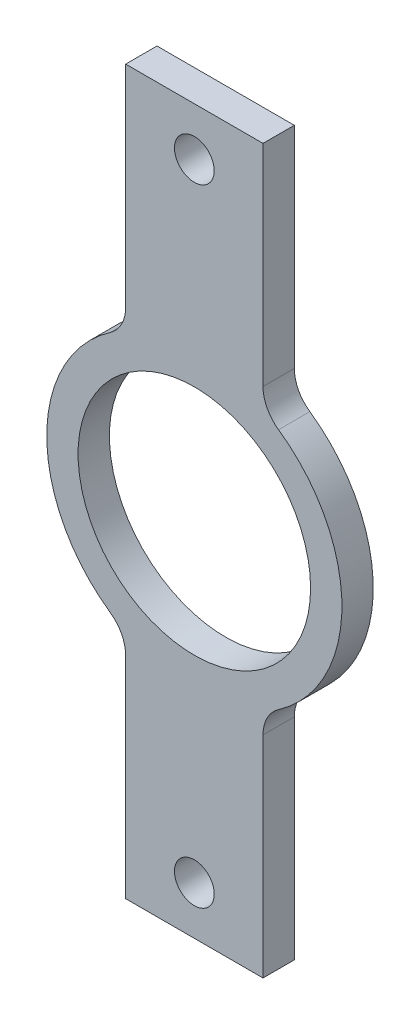
ISO-10303-21;
HEADER;
FILE_DESCRIPTION(('STEP AP214'),'2;1');
FILE_NAME('part.step','',(''),(''),'','','');
FILE_SCHEMA(('AUTOMOTIVE_DESIGN { 1 0 10303 214 1 1 1 1 }'));
ENDSEC;
DATA;
#1=APPLICATION_CONTEXT('core data for automotive mechanical design processes');
#2=APPLICATION_PROTOCOL_DEFINITION('international standard','automotive_design',2000,#1);
#3=PRODUCT_CONTEXT('',#1,'mechanical');
#4=PRODUCT('Part','Part','',(#3));
#5=PRODUCT_RELATED_PRODUCT_CATEGORY('part','',(#4));
#6=PRODUCT_DEFINITION_FORMATION('','',#4);
#7=PRODUCT_DEFINITION_CONTEXT('part definition',#1,'design');
#8=PRODUCT_DEFINITION('design','',#6,#7);
#9=PRODUCT_DEFINITION_SHAPE('','',#8);
#10=(LENGTH_UNIT() NAMED_UNIT(*) SI_UNIT(.MILLI.,.METRE.));
#11=(NAMED_UNIT(*) PLANE_ANGLE_UNIT() SI_UNIT($,.RADIAN.));
#12=(NAMED_UNIT(*) SI_UNIT($,.STERADIAN.) SOLID_ANGLE_UNIT());
#13=UNCERTAINTY_MEASURE_WITH_UNIT(LENGTH_MEASURE(1.E-05),#10,'distance_accuracy_value','');
#14=(GEOMETRIC_REPRESENTATION_CONTEXT(3) GLOBAL_UNCERTAINTY_ASSIGNED_CONTEXT((#13)) GLOBAL_UNIT_ASSIGNED_CONTEXT((#10,
#11,#12)) REPRESENTATION_CONTEXT('',''));
#15=CARTESIAN_POINT('',(0.,0.,0.));
#16=DIRECTION('',(0.,0.,1.));
#17=DIRECTION('',(1.,0.,0.));
#18=AXIS2_PLACEMENT_3D('',#15,#16,#17);
#19=CARTESIAN_POINT('',(0.,0.,2.6));
#20=DIRECTION('',(0.,0.,1.));
#21=DIRECTION('',(1.,0.,0.));
#22=AXIS2_PLACEMENT_3D('',#19,#20,#21);
#23=PLANE('',#22);
#24=CARTESIAN_POINT('',(0.,26.,2.6));
#25=DIRECTION('',(0.,0.,1.));
#26=DIRECTION('',(1.,0.,0.));
#27=AXIS2_PLACEMENT_3D('',#24,#25,#26);
#28=CIRCLE('',#27,1.65);
#29=CARTESIAN_POINT('',(1.65,26.,2.6));
#30=VERTEX_POINT('',#29);
#31=EDGE_CURVE('E299',#30,#30,#28,.T.);
#32=ORIENTED_EDGE('',*,*,#31,.F.);
#33=EDGE_LOOP('',(#32));
#34=FACE_BOUND('',#33,.T.);
#35=DIRECTION('',(0.,1.,0.));
#36=VECTOR('',#35,1.);
#37=CARTESIAN_POINT('',(5.7,-30.,2.6));
#38=LINE('',#37,#36);
#39=CARTESIAN_POINT('',(5.7,-30.,2.6));
#40=VERTEX_POINT('',#39);
#41=CARTESIAN_POINT('',(5.7,-12.5248752488797,2.6));
#42=VERTEX_POINT('',#41);
#43=EDGE_CURVE('E156',#40,#42,#38,.T.);
#44=ORIENTED_EDGE('',*,*,#43,.T.);
#45=CARTESIAN_POINT('',(8.7,-12.5248752488797,2.6));
#46=DIRECTION('',(0.,0.,1.));
#47=DIRECTION('',(1.,0.,0.));
#48=AXIS2_PLACEMENT_3D('',#45,#46,#47);
#49=CIRCLE('',#48,3.);
#50=CARTESIAN_POINT('',(6.98852459016393,-10.0609653638542,2.6));
#51=VERTEX_POINT('',#50);
#52=EDGE_CURVE('E205',#42,#51,#49,.F.);
#53=ORIENTED_EDGE('',*,*,#52,.T.);
#54=CARTESIAN_POINT('',(0.,0.,2.6));
#55=DIRECTION('',(0.,0.,1.));
#56=DIRECTION('',(1.,0.,0.));
#57=AXIS2_PLACEMENT_3D('',#54,#55,#56);
#58=CIRCLE('',#57,12.25);
#59=CARTESIAN_POINT('',(6.98852459016393,10.0609653638542,2.6));
#60=VERTEX_POINT('',#59);
#61=EDGE_CURVE('E129',#51,#60,#58,.T.);
#62=ORIENTED_EDGE('',*,*,#61,.T.);
#63=CARTESIAN_POINT('',(8.7,12.5248752488797,2.6));
#64=DIRECTION('',(0.,0.,1.));
#65=DIRECTION('',(1.,0.,0.));
#66=AXIS2_PLACEMENT_3D('',#63,#64,#65);
#67=CIRCLE('',#66,3.);
#68=CARTESIAN_POINT('',(5.7,12.5248752488797,2.6));
#69=VERTEX_POINT('',#68);
#70=EDGE_CURVE('E11',#60,#69,#67,.F.);
#71=ORIENTED_EDGE('',*,*,#70,.T.);
#72=DIRECTION('',(0.,1.,0.));
#73=VECTOR('',#72,1.);
#74=CARTESIAN_POINT('',(5.7,10.8430853542707,2.6));
#75=LINE('',#74,#73);
#76=CARTESIAN_POINT('',(5.7,30.,2.6));
#77=VERTEX_POINT('',#76);
#78=EDGE_CURVE('E120',#69,#77,#75,.T.);
#79=ORIENTED_EDGE('',*,*,#78,.T.);
#80=DIRECTION('',(-1.,0.,0.));
#81=VECTOR('',#80,1.);
#82=CARTESIAN_POINT('',(5.7,30.,2.6));
#83=LINE('',#82,#81);
#84=CARTESIAN_POINT('',(-5.7,30.,2.6));
#85=VERTEX_POINT('',#84);
#86=EDGE_CURVE('E126',#77,#85,#83,.T.);
#87=ORIENTED_EDGE('',*,*,#86,.T.);
#88=DIRECTION('',(0.,-1.,0.));
#89=VECTOR('',#88,1.);
#90=CARTESIAN_POINT('',(-5.7,30.,2.6));
#91=LINE('',#90,#89);
#92=CARTESIAN_POINT('',(-5.7,12.5248752488797,2.6));
#93=VERTEX_POINT('',#92);
#94=EDGE_CURVE('E144',#85,#93,#91,.T.);
#95=ORIENTED_EDGE('',*,*,#94,.T.);
#96=CARTESIAN_POINT('',(-8.7,12.5248752488797,2.6));
#97=DIRECTION('',(0.,0.,1.));
#98=DIRECTION('',(1.,0.,0.));
#99=AXIS2_PLACEMENT_3D('',#96,#97,#98);
#100=CIRCLE('',#99,3.);
#101=CARTESIAN_POINT('',(-6.98852459016393,10.0609653638542,2.6));
#102=VERTEX_POINT('',#101);
#103=EDGE_CURVE('E213',#93,#102,#100,.F.);
#104=ORIENTED_EDGE('',*,*,#103,.T.);
#105=CARTESIAN_POINT('',(0.,0.,2.6));
#106=DIRECTION('',(0.,0.,1.));
#107=DIRECTION('',(1.,0.,0.));
#108=AXIS2_PLACEMENT_3D('',#105,#106,#107);
#109=CIRCLE('',#108,12.25);
#110=CARTESIAN_POINT('',(-6.98852459016393,-10.0609653638542,2.6));
#111=VERTEX_POINT('',#110);
#112=EDGE_CURVE('E146',#102,#111,#109,.T.);
#113=ORIENTED_EDGE('',*,*,#112,.T.);
#114=CARTESIAN_POINT('',(-8.7,-12.5248752488797,2.6));
#115=DIRECTION('',(0.,0.,1.));
#116=DIRECTION('',(1.,0.,0.));
#117=AXIS2_PLACEMENT_3D('',#114,#115,#116);
#118=CIRCLE('',#117,3.);
#119=CARTESIAN_POINT('',(-5.7,-12.5248752488797,2.6));
#120=VERTEX_POINT('',#119);
#121=EDGE_CURVE('E209',#111,#120,#118,.F.);
#122=ORIENTED_EDGE('',*,*,#121,.T.);
#123=DIRECTION('',(0.,-1.,0.));
#124=VECTOR('',#123,1.);
#125=CARTESIAN_POINT('',(-5.7,-10.8430853542707,2.6));
#126=LINE('',#125,#124);
#127=CARTESIAN_POINT('',(-5.69999999999999,-30.,2.6));
#128=VERTEX_POINT('',#127);
#129=EDGE_CURVE('E152',#120,#128,#126,.T.);
#130=ORIENTED_EDGE('',*,*,#129,.T.);
#131=DIRECTION('',(1.,0.,0.));
#132=VECTOR('',#131,1.);
#133=CARTESIAN_POINT('',(-5.69999999999999,-30.,2.6));
#134=LINE('',#133,#132);
#135=EDGE_CURVE('E154',#128,#40,#134,.T.);
#136=ORIENTED_EDGE('',*,*,#135,.T.);
#137=EDGE_LOOP('',(#44,#53,#62,#71,#79,#87,#95,#104,#113,#122,#130,#136));
#138=FACE_BOUND('',#137,.T.);
#139=CARTESIAN_POINT('',(0.,0.,2.6));
#140=DIRECTION('',(0.,0.,1.));
#141=DIRECTION('',(1.,0.,0.));
#142=AXIS2_PLACEMENT_3D('',#139,#140,#141);
#143=CIRCLE('',#142,9.65);
#144=CARTESIAN_POINT('',(9.65,0.,2.6));
#145=VERTEX_POINT('',#144);
#146=EDGE_CURVE('E162',#145,#145,#143,.T.);
#147=ORIENTED_EDGE('',*,*,#146,.F.);
#148=EDGE_LOOP('',(#147));
#149=FACE_BOUND('',#148,.T.);
#150=CARTESIAN_POINT('',(0.,-26.,2.6));
#151=DIRECTION('',(0.,0.,1.));
#152=DIRECTION('',(1.,0.,0.));
#153=AXIS2_PLACEMENT_3D('',#150,#151,#152);
#154=CIRCLE('',#153,1.65);
#155=CARTESIAN_POINT('',(1.65,-26.,2.6));
#156=VERTEX_POINT('',#155);
#157=EDGE_CURVE('E305',#156,#156,#154,.T.);
#158=ORIENTED_EDGE('',*,*,#157,.F.);
#159=EDGE_LOOP('',(#158));
#160=FACE_BOUND('',#159,.T.);
#161=ADVANCED_FACE('F35',(#34,#138,#149,#160),#23,.T.);
#162=CARTESIAN_POINT('',(0.,0.,0.));
#163=DIRECTION('',(0.,0.,1.));
#164=DIRECTION('',(1.,0.,0.));
#165=AXIS2_PLACEMENT_3D('',#162,#163,#164);
#166=PLANE('',#165);
#167=CARTESIAN_POINT('',(0.,0.,0.));
#168=DIRECTION('',(0.,0.,1.));
#169=DIRECTION('',(1.,0.,0.));
#170=AXIS2_PLACEMENT_3D('',#167,#168,#169);
#171=CIRCLE('',#170,12.25);
#172=CARTESIAN_POINT('',(6.98852459016393,-10.0609653638542,0.));
#173=VERTEX_POINT('',#172);
#174=CARTESIAN_POINT('',(6.98852459016393,10.0609653638542,0.));
#175=VERTEX_POINT('',#174);
#176=EDGE_CURVE('E159',#173,#175,#171,.T.);
#177=ORIENTED_EDGE('',*,*,#176,.F.);
#178=CARTESIAN_POINT('',(8.7,-12.5248752488797,0.));
#179=DIRECTION('',(0.,0.,1.));
#180=DIRECTION('',(1.,0.,0.));
#181=AXIS2_PLACEMENT_3D('',#178,#179,#180);
#182=CIRCLE('',#181,3.);
#183=CARTESIAN_POINT('',(5.7,-12.5248752488797,0.));
#184=VERTEX_POINT('',#183);
#185=EDGE_CURVE('E203',#173,#184,#182,.T.);
#186=ORIENTED_EDGE('',*,*,#185,.T.);
#187=DIRECTION('',(0.,1.,0.));
#188=VECTOR('',#187,1.);
#189=CARTESIAN_POINT('',(5.7,-30.,0.));
#190=LINE('',#189,#188);
#191=CARTESIAN_POINT('',(5.7,-30.,0.));
#192=VERTEX_POINT('',#191);
#193=EDGE_CURVE('E176',#192,#184,#190,.T.);
#194=ORIENTED_EDGE('',*,*,#193,.F.);
#195=DIRECTION('',(1.,0.,0.));
#196=VECTOR('',#195,1.);
#197=CARTESIAN_POINT('',(0.,-30.,0.));
#198=LINE('',#197,#196);
#199=CARTESIAN_POINT('',(-5.69999999999999,-30.,0.));
#200=VERTEX_POINT('',#199);
#201=EDGE_CURVE('E174',#200,#192,#198,.T.);
#202=ORIENTED_EDGE('',*,*,#201,.F.);
#203=DIRECTION('',(0.,-1.,0.));
#204=VECTOR('',#203,1.);
#205=CARTESIAN_POINT('',(-5.7,-10.8430853542707,0.));
#206=LINE('',#205,#204);
#207=CARTESIAN_POINT('',(-5.7,-12.5248752488797,0.));
#208=VERTEX_POINT('',#207);
#209=EDGE_CURVE('E172',#208,#200,#206,.T.);
#210=ORIENTED_EDGE('',*,*,#209,.F.);
#211=CARTESIAN_POINT('',(-8.7,-12.5248752488797,0.));
#212=DIRECTION('',(0.,0.,1.));
#213=DIRECTION('',(1.,0.,0.));
#214=AXIS2_PLACEMENT_3D('',#211,#212,#213);
#215=CIRCLE('',#214,3.);
#216=CARTESIAN_POINT('',(-6.98852459016393,-10.0609653638542,0.));
#217=VERTEX_POINT('',#216);
#218=EDGE_CURVE('E207',#208,#217,#215,.T.);
#219=ORIENTED_EDGE('',*,*,#218,.T.);
#220=CARTESIAN_POINT('',(0.,0.,0.));
#221=DIRECTION('',(0.,0.,1.));
#222=DIRECTION('',(1.,0.,0.));
#223=AXIS2_PLACEMENT_3D('',#220,#221,#222);
#224=CIRCLE('',#223,12.25);
#225=CARTESIAN_POINT('',(-6.98852459016393,10.0609653638542,0.));
#226=VERTEX_POINT('',#225);
#227=EDGE_CURVE('E169',#226,#217,#224,.T.);
#228=ORIENTED_EDGE('',*,*,#227,.F.);
#229=CARTESIAN_POINT('',(-8.7,12.5248752488797,0.));
#230=DIRECTION('',(0.,0.,1.));
#231=DIRECTION('',(1.,0.,0.));
#232=AXIS2_PLACEMENT_3D('',#229,#230,#231);
#233=CIRCLE('',#232,3.);
#234=CARTESIAN_POINT('',(-5.7,12.5248752488797,0.));
#235=VERTEX_POINT('',#234);
#236=EDGE_CURVE('E211',#226,#235,#233,.T.);
#237=ORIENTED_EDGE('',*,*,#236,.T.);
#238=DIRECTION('',(0.,-1.,0.));
#239=VECTOR('',#238,1.);
#240=CARTESIAN_POINT('',(-5.7,30.,0.));
#241=LINE('',#240,#239);
#242=CARTESIAN_POINT('',(-5.7,30.,0.));
#243=VERTEX_POINT('',#242);
#244=EDGE_CURVE('E166',#243,#235,#241,.T.);
#245=ORIENTED_EDGE('',*,*,#244,.F.);
#246=DIRECTION('',(-1.,0.,0.));
#247=VECTOR('',#246,1.);
#248=CARTESIAN_POINT('',(0.,30.,0.));
#249=LINE('',#248,#247);
#250=CARTESIAN_POINT('',(5.7,30.,0.));
#251=VERTEX_POINT('',#250);
#252=EDGE_CURVE('E164',#251,#243,#249,.T.);
#253=ORIENTED_EDGE('',*,*,#252,.F.);
#254=DIRECTION('',(0.,1.,0.));
#255=VECTOR('',#254,1.);
#256=CARTESIAN_POINT('',(5.7,10.8430853542707,0.));
#257=LINE('',#256,#255);
#258=CARTESIAN_POINT('',(5.7,12.5248752488797,0.));
#259=VERTEX_POINT('',#258);
#260=EDGE_CURVE('E135',#259,#251,#257,.T.);
#261=ORIENTED_EDGE('',*,*,#260,.F.);
#262=CARTESIAN_POINT('',(8.7,12.5248752488797,0.));
#263=DIRECTION('',(0.,0.,1.));
#264=DIRECTION('',(1.,0.,0.));
#265=AXIS2_PLACEMENT_3D('',#262,#263,#264);
#266=CIRCLE('',#265,3.);
#267=EDGE_CURVE('E43',#259,#175,#266,.T.);
#268=ORIENTED_EDGE('',*,*,#267,.T.);
#269=EDGE_LOOP('',(#177,#186,#194,#202,#210,#219,#228,#237,#245,#253,#261,#268));
#270=FACE_BOUND('',#269,.T.);
#271=CARTESIAN_POINT('',(0.,0.,0.));
#272=DIRECTION('',(0.,0.,1.));
#273=DIRECTION('',(1.,0.,0.));
#274=AXIS2_PLACEMENT_3D('',#271,#272,#273);
#275=CIRCLE('',#274,9.65);
#276=CARTESIAN_POINT('',(9.65,0.,0.));
#277=VERTEX_POINT('',#276);
#278=EDGE_CURVE('E296',#277,#277,#275,.T.);
#279=ORIENTED_EDGE('',*,*,#278,.T.);
#280=EDGE_LOOP('',(#279));
#281=FACE_BOUND('',#280,.T.);
#282=CARTESIAN_POINT('',(0.,26.,0.));
#283=DIRECTION('',(0.,0.,1.));
#284=DIRECTION('',(1.,0.,0.));
#285=AXIS2_PLACEMENT_3D('',#282,#283,#284);
#286=CIRCLE('',#285,1.65);
#287=CARTESIAN_POINT('',(1.65,26.,0.));
#288=VERTEX_POINT('',#287);
#289=EDGE_CURVE('E302',#288,#288,#286,.T.);
#290=ORIENTED_EDGE('',*,*,#289,.T.);
#291=EDGE_LOOP('',(#290));
#292=FACE_BOUND('',#291,.T.);
#293=CARTESIAN_POINT('',(0.,-26.,0.));
#294=DIRECTION('',(0.,0.,1.));
#295=DIRECTION('',(1.,0.,0.));
#296=AXIS2_PLACEMENT_3D('',#293,#294,#295);
#297=CIRCLE('',#296,1.65);
#298=CARTESIAN_POINT('',(1.65,-26.,0.));
#299=VERTEX_POINT('',#298);
#300=EDGE_CURVE('E308',#299,#299,#297,.T.);
#301=ORIENTED_EDGE('',*,*,#300,.T.);
#302=EDGE_LOOP('',(#301));
#303=FACE_BOUND('',#302,.T.);
#304=ADVANCED_FACE('F216',(#270,#281,#292,#303),#166,.F.);
#305=CARTESIAN_POINT('',(0.,0.,2.6));
#306=DIRECTION('',(0.,0.,-1.));
#307=DIRECTION('',(-1.,0.,0.));
#308=AXIS2_PLACEMENT_3D('',#305,#306,#307);
#309=CYLINDRICAL_SURFACE('',#308,12.25);
#310=ORIENTED_EDGE('',*,*,#61,.F.);
#311=DIRECTION('',(0.,0.,-1.));
#312=VECTOR('',#311,1.);
#313=CARTESIAN_POINT('',(6.98852459016393,-10.0609653638542,2.6));
#314=LINE('',#313,#312);
#315=EDGE_CURVE('E186',#51,#173,#314,.T.);
#316=ORIENTED_EDGE('',*,*,#315,.T.);
#317=ORIENTED_EDGE('',*,*,#176,.T.);
#318=DIRECTION('',(0.,0.,-1.));
#319=VECTOR('',#318,1.);
#320=CARTESIAN_POINT('',(6.98852459016393,10.0609653638542,2.6));
#321=LINE('',#320,#319);
#322=EDGE_CURVE('E138',#175,#60,#321,.F.);
#323=ORIENTED_EDGE('',*,*,#322,.T.);
#324=EDGE_LOOP('',(#310,#316,#317,#323));
#325=FACE_BOUND('',#324,.T.);
#326=ADVANCED_FACE('F220',(#325),#309,.T.);
#327=CARTESIAN_POINT('',(5.7,10.8430853542707,2.6));
#328=DIRECTION('',(-1.,0.,0.));
#329=DIRECTION('',(0.,0.,1.));
#330=AXIS2_PLACEMENT_3D('',#327,#328,#329);
#331=PLANE('',#330);
#332=ORIENTED_EDGE('',*,*,#78,.F.);
#333=DIRECTION('',(0.,0.,1.));
#334=VECTOR('',#333,1.);
#335=CARTESIAN_POINT('',(5.7,12.5248752488797,0.));
#336=LINE('',#335,#334);
#337=EDGE_CURVE('E201',#69,#259,#336,.F.);
#338=ORIENTED_EDGE('',*,*,#337,.T.);
#339=ORIENTED_EDGE('',*,*,#260,.T.);
#340=DIRECTION('',(0.,0.,-1.));
#341=VECTOR('',#340,1.);
#342=CARTESIAN_POINT('',(5.7,30.,2.6));
#343=LINE('',#342,#341);
#344=EDGE_CURVE('E132',#77,#251,#343,.T.);
#345=ORIENTED_EDGE('',*,*,#344,.F.);
#346=EDGE_LOOP('',(#332,#338,#339,#345));
#347=FACE_BOUND('',#346,.T.);
#348=ADVANCED_FACE('F133',(#347),#331,.F.);
#349=CARTESIAN_POINT('',(0.,30.,2.6));
#350=DIRECTION('',(0.,-1.,0.));
#351=DIRECTION('',(0.,0.,-1.));
#352=AXIS2_PLACEMENT_3D('',#349,#350,#351);
#353=PLANE('',#352);
#354=ORIENTED_EDGE('',*,*,#252,.T.);
#355=DIRECTION('',(0.,0.,-1.));
#356=VECTOR('',#355,1.);
#357=CARTESIAN_POINT('',(-5.7,30.,2.6));
#358=LINE('',#357,#356);
#359=EDGE_CURVE('E139',#85,#243,#358,.T.);
#360=ORIENTED_EDGE('',*,*,#359,.F.);
#361=ORIENTED_EDGE('',*,*,#86,.F.);
#362=ORIENTED_EDGE('',*,*,#344,.T.);
#363=EDGE_LOOP('',(#354,#360,#361,#362));
#364=FACE_BOUND('',#363,.T.);
#365=ADVANCED_FACE('F141',(#364),#353,.F.);
#366=CARTESIAN_POINT('',(-5.7,30.,2.6));
#367=DIRECTION('',(1.,0.,0.));
#368=DIRECTION('',(0.,1.,0.));
#369=AXIS2_PLACEMENT_3D('',#366,#367,#368);
#370=PLANE('',#369);
#371=ORIENTED_EDGE('',*,*,#244,.T.);
#372=DIRECTION('',(0.,0.,1.));
#373=VECTOR('',#372,1.);
#374=CARTESIAN_POINT('',(-5.7,12.5248752488797,2.6));
#375=LINE('',#374,#373);
#376=EDGE_CURVE('E199',#235,#93,#375,.T.);
#377=ORIENTED_EDGE('',*,*,#376,.T.);
#378=ORIENTED_EDGE('',*,*,#94,.F.);
#379=ORIENTED_EDGE('',*,*,#359,.T.);
#380=EDGE_LOOP('',(#371,#377,#378,#379));
#381=FACE_BOUND('',#380,.T.);
#382=ADVANCED_FACE('F256',(#381),#370,.F.);
#383=CARTESIAN_POINT('',(0.,0.,2.6));
#384=DIRECTION('',(0.,0.,-1.));
#385=DIRECTION('',(-1.,0.,0.));
#386=AXIS2_PLACEMENT_3D('',#383,#384,#385);
#387=CYLINDRICAL_SURFACE('',#386,12.25);
#388=ORIENTED_EDGE('',*,*,#227,.T.);
#389=DIRECTION('',(0.,0.,-1.));
#390=VECTOR('',#389,1.);
#391=CARTESIAN_POINT('',(-6.98852459016393,-10.0609653638542,2.6));
#392=LINE('',#391,#390);
#393=EDGE_CURVE('E197',#217,#111,#392,.F.);
#394=ORIENTED_EDGE('',*,*,#393,.T.);
#395=ORIENTED_EDGE('',*,*,#112,.F.);
#396=DIRECTION('',(0.,0.,-1.));
#397=VECTOR('',#396,1.);
#398=CARTESIAN_POINT('',(-6.98852459016393,10.0609653638542,2.6));
#399=LINE('',#398,#397);
#400=EDGE_CURVE('E194',#102,#226,#399,.T.);
#401=ORIENTED_EDGE('',*,*,#400,.T.);
#402=EDGE_LOOP('',(#388,#394,#395,#401));
#403=FACE_BOUND('',#402,.T.);
#404=ADVANCED_FACE('F252',(#403),#387,.T.);
#405=CARTESIAN_POINT('',(-5.7,-10.8430853542707,2.6));
#406=DIRECTION('',(1.,0.,0.));
#407=DIRECTION('',(0.,1.,0.));
#408=AXIS2_PLACEMENT_3D('',#405,#406,#407);
#409=PLANE('',#408);
#410=ORIENTED_EDGE('',*,*,#129,.F.);
#411=DIRECTION('',(0.,0.,1.));
#412=VECTOR('',#411,1.);
#413=CARTESIAN_POINT('',(-5.7,-12.5248752488797,0.));
#414=LINE('',#413,#412);
#415=EDGE_CURVE('E191',#120,#208,#414,.F.);
#416=ORIENTED_EDGE('',*,*,#415,.T.);
#417=ORIENTED_EDGE('',*,*,#209,.T.);
#418=DIRECTION('',(0.,0.,-1.));
#419=VECTOR('',#418,1.);
#420=CARTESIAN_POINT('',(-5.69999999999999,-30.,2.6));
#421=LINE('',#420,#419);
#422=EDGE_CURVE('E181',#128,#200,#421,.T.);
#423=ORIENTED_EDGE('',*,*,#422,.F.);
#424=EDGE_LOOP('',(#410,#416,#417,#423));
#425=FACE_BOUND('',#424,.T.);
#426=ADVANCED_FACE('F248',(#425),#409,.F.);
#427=CARTESIAN_POINT('',(0.,-30.,2.6));
#428=DIRECTION('',(0.,1.,0.));
#429=DIRECTION('',(0.,0.,1.));
#430=AXIS2_PLACEMENT_3D('',#427,#428,#429);
#431=PLANE('',#430);
#432=ORIENTED_EDGE('',*,*,#201,.T.);
#433=DIRECTION('',(0.,0.,-1.));
#434=VECTOR('',#433,1.);
#435=CARTESIAN_POINT('',(5.7,-30.,2.6));
#436=LINE('',#435,#434);
#437=EDGE_CURVE('E158',#40,#192,#436,.T.);
#438=ORIENTED_EDGE('',*,*,#437,.F.);
#439=ORIENTED_EDGE('',*,*,#135,.F.);
#440=ORIENTED_EDGE('',*,*,#422,.T.);
#441=EDGE_LOOP('',(#432,#438,#439,#440));
#442=FACE_BOUND('',#441,.T.);
#443=ADVANCED_FACE('F244',(#442),#431,.F.);
#444=CARTESIAN_POINT('',(5.7,-30.,2.6));
#445=DIRECTION('',(-1.,0.,0.));
#446=DIRECTION('',(0.,0.,1.));
#447=AXIS2_PLACEMENT_3D('',#444,#445,#446);
#448=PLANE('',#447);
#449=ORIENTED_EDGE('',*,*,#193,.T.);
#450=DIRECTION('',(0.,0.,1.));
#451=VECTOR('',#450,1.);
#452=CARTESIAN_POINT('',(5.7,-12.5248752488797,2.6));
#453=LINE('',#452,#451);
#454=EDGE_CURVE('E189',#184,#42,#453,.T.);
#455=ORIENTED_EDGE('',*,*,#454,.T.);
#456=ORIENTED_EDGE('',*,*,#43,.F.);
#457=ORIENTED_EDGE('',*,*,#437,.T.);
#458=EDGE_LOOP('',(#449,#455,#456,#457));
#459=FACE_BOUND('',#458,.T.);
#460=ADVANCED_FACE('F241',(#459),#448,.F.);
#461=CARTESIAN_POINT('',(0.,0.,2.6));
#462=DIRECTION('',(0.,0.,-1.));
#463=DIRECTION('',(-1.,0.,0.));
#464=AXIS2_PLACEMENT_3D('',#461,#462,#463);
#465=CYLINDRICAL_SURFACE('',#464,9.65);
#466=ORIENTED_EDGE('',*,*,#146,.T.);
#467=EDGE_LOOP('',(#466));
#468=FACE_BOUND('',#467,.T.);
#469=ORIENTED_EDGE('',*,*,#278,.F.);
#470=EDGE_LOOP('',(#469));
#471=FACE_BOUND('',#470,.T.);
#472=ADVANCED_FACE('F238',(#468,#471),#465,.F.);
#473=CARTESIAN_POINT('',(0.,26.,2.6));
#474=DIRECTION('',(0.,0.,-1.));
#475=DIRECTION('',(-1.,0.,0.));
#476=AXIS2_PLACEMENT_3D('',#473,#474,#475);
#477=CYLINDRICAL_SURFACE('',#476,1.65);
#478=ORIENTED_EDGE('',*,*,#31,.T.);
#479=EDGE_LOOP('',(#478));
#480=FACE_BOUND('',#479,.T.);
#481=ORIENTED_EDGE('',*,*,#289,.F.);
#482=EDGE_LOOP('',(#481));
#483=FACE_BOUND('',#482,.T.);
#484=ADVANCED_FACE('F317',(#480,#483),#477,.F.);
#485=CARTESIAN_POINT('',(0.,-26.,2.6));
#486=DIRECTION('',(0.,0.,-1.));
#487=DIRECTION('',(-1.,0.,0.));
#488=AXIS2_PLACEMENT_3D('',#485,#486,#487);
#489=CYLINDRICAL_SURFACE('',#488,1.65);
#490=ORIENTED_EDGE('',*,*,#157,.T.);
#491=EDGE_LOOP('',(#490));
#492=FACE_BOUND('',#491,.T.);
#493=ORIENTED_EDGE('',*,*,#300,.F.);
#494=EDGE_LOOP('',(#493));
#495=FACE_BOUND('',#494,.T.);
#496=ADVANCED_FACE('F270',(#492,#495),#489,.F.);
#497=CARTESIAN_POINT('',(8.7,-12.5248752488797,2.6));
#498=DIRECTION('',(0.,0.,-1.));
#499=DIRECTION('',(-1.,0.,0.));
#500=AXIS2_PLACEMENT_3D('',#497,#498,#499);
#501=CYLINDRICAL_SURFACE('',#500,3.);
#502=ORIENTED_EDGE('',*,*,#52,.F.);
#503=ORIENTED_EDGE('',*,*,#454,.F.);
#504=ORIENTED_EDGE('',*,*,#185,.F.);
#505=ORIENTED_EDGE('',*,*,#315,.F.);
#506=EDGE_LOOP('',(#502,#503,#504,#505));
#507=FACE_BOUND('',#506,.T.);
#508=ADVANCED_FACE('F267',(#507),#501,.F.);
#509=CARTESIAN_POINT('',(-8.7,-12.5248752488797,2.6));
#510=DIRECTION('',(0.,0.,-1.));
#511=DIRECTION('',(-1.,0.,0.));
#512=AXIS2_PLACEMENT_3D('',#509,#510,#511);
#513=CYLINDRICAL_SURFACE('',#512,3.);
#514=ORIENTED_EDGE('',*,*,#121,.F.);
#515=ORIENTED_EDGE('',*,*,#393,.F.);
#516=ORIENTED_EDGE('',*,*,#218,.F.);
#517=ORIENTED_EDGE('',*,*,#415,.F.);
#518=EDGE_LOOP('',(#514,#515,#516,#517));
#519=FACE_BOUND('',#518,.T.);
#520=ADVANCED_FACE('F227',(#519),#513,.F.);
#521=CARTESIAN_POINT('',(-8.7,12.5248752488797,2.6));
#522=DIRECTION('',(0.,0.,-1.));
#523=DIRECTION('',(-1.,0.,0.));
#524=AXIS2_PLACEMENT_3D('',#521,#522,#523);
#525=CYLINDRICAL_SURFACE('',#524,3.);
#526=ORIENTED_EDGE('',*,*,#103,.F.);
#527=ORIENTED_EDGE('',*,*,#376,.F.);
#528=ORIENTED_EDGE('',*,*,#236,.F.);
#529=ORIENTED_EDGE('',*,*,#400,.F.);
#530=EDGE_LOOP('',(#526,#527,#528,#529));
#531=FACE_BOUND('',#530,.T.);
#532=ADVANCED_FACE('F223',(#531),#525,.F.);
#533=CARTESIAN_POINT('',(8.7,12.5248752488797,2.6));
#534=DIRECTION('',(0.,0.,-1.));
#535=DIRECTION('',(-1.,0.,0.));
#536=AXIS2_PLACEMENT_3D('',#533,#534,#535);
#537=CYLINDRICAL_SURFACE('',#536,3.);
#538=ORIENTED_EDGE('',*,*,#70,.F.);
#539=ORIENTED_EDGE('',*,*,#322,.F.);
#540=ORIENTED_EDGE('',*,*,#267,.F.);
#541=ORIENTED_EDGE('',*,*,#337,.F.);
#542=EDGE_LOOP('',(#538,#539,#540,#541));
#543=FACE_BOUND('',#542,.T.);
#544=ADVANCED_FACE('F37',(#543),#537,.F.);
#545=CLOSED_SHELL('',(#161,#304,#326,#348,#365,#382,#404,#426,#443,#460,#472,#484,#496,#508,
#520,#532,#544));
#546=MANIFOLD_SOLID_BREP('B2',#545);
#547=ADVANCED_BREP_SHAPE_REPRESENTATION('',(#18,#546),#14);
#548=SHAPE_DEFINITION_REPRESENTATION(#9,#547);
ENDSEC;
END-ISO-10303-21;
